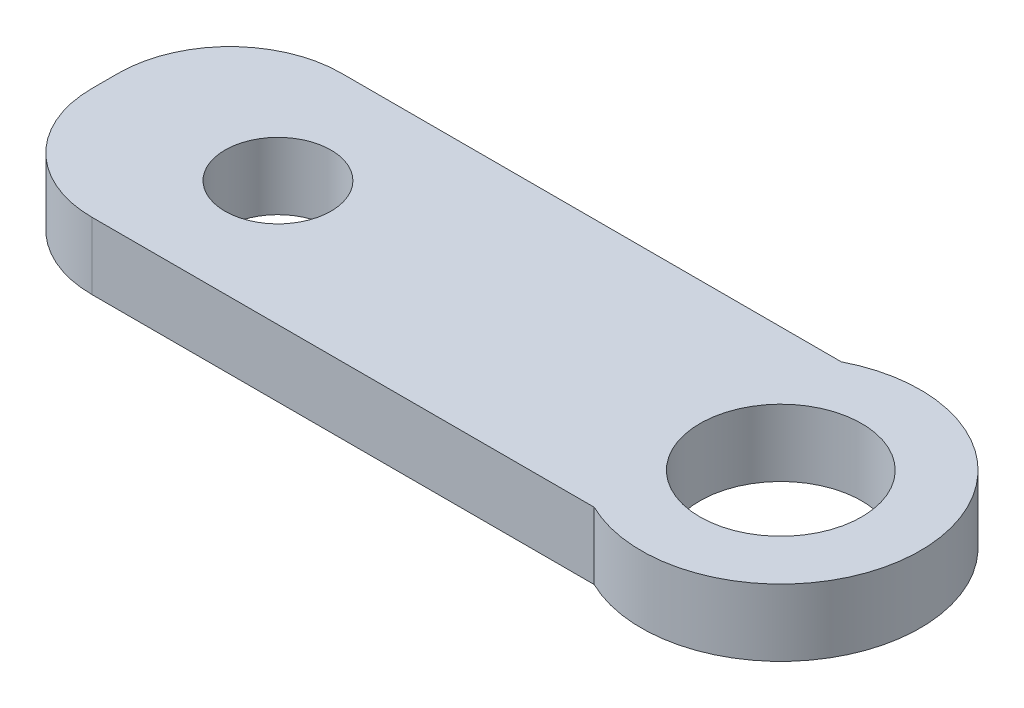
ISO-10303-21;
HEADER;
FILE_DESCRIPTION(('STEP AP214'),'2;1');
FILE_NAME('part.step','',(''),(''),'','','');
FILE_SCHEMA(('AUTOMOTIVE_DESIGN { 1 0 10303 214 1 1 1 1 }'));
ENDSEC;
DATA;
#1=APPLICATION_CONTEXT('core data for automotive mechanical design processes');
#2=APPLICATION_PROTOCOL_DEFINITION('international standard','automotive_design',2000,#1);
#3=PRODUCT_CONTEXT('',#1,'mechanical');
#4=PRODUCT('Part','Part','',(#3));
#5=PRODUCT_RELATED_PRODUCT_CATEGORY('part','',(#4));
#6=PRODUCT_DEFINITION_FORMATION('','',#4);
#7=PRODUCT_DEFINITION_CONTEXT('part definition',#1,'design');
#8=PRODUCT_DEFINITION('design','',#6,#7);
#9=PRODUCT_DEFINITION_SHAPE('','',#8);
#10=(LENGTH_UNIT() NAMED_UNIT(*) SI_UNIT(.MILLI.,.METRE.));
#11=(NAMED_UNIT(*) PLANE_ANGLE_UNIT() SI_UNIT($,.RADIAN.));
#12=(NAMED_UNIT(*) SI_UNIT($,.STERADIAN.) SOLID_ANGLE_UNIT());
#13=UNCERTAINTY_MEASURE_WITH_UNIT(LENGTH_MEASURE(1.E-05),#10,'distance_accuracy_value','');
#14=(GEOMETRIC_REPRESENTATION_CONTEXT(3) GLOBAL_UNCERTAINTY_ASSIGNED_CONTEXT((#13)) GLOBAL_UNIT_ASSIGNED_CONTEXT((#10,
#11,#12)) REPRESENTATION_CONTEXT('',''));
#15=CARTESIAN_POINT('',(0.,0.,0.));
#16=DIRECTION('',(0.,0.,1.));
#17=DIRECTION('',(1.,0.,0.));
#18=AXIS2_PLACEMENT_3D('',#15,#16,#17);
#19=CARTESIAN_POINT('',(0.,1.2,0.));
#20=DIRECTION('',(0.,-1.,0.));
#21=DIRECTION('',(0.,0.,-1.));
#22=AXIS2_PLACEMENT_3D('',#19,#20,#21);
#23=CYLINDRICAL_SURFACE('',#22,2.5);
#24=CARTESIAN_POINT('',(0.,0.,0.));
#25=DIRECTION('',(0.,1.,0.));
#26=DIRECTION('',(0.,0.,1.));
#27=AXIS2_PLACEMENT_3D('',#24,#25,#26);
#28=CIRCLE('',#27,2.5);
#29=CARTESIAN_POINT('',(-1.09697996320801,0.,2.24647166915591));
#30=VERTEX_POINT('',#29);
#31=CARTESIAN_POINT('',(-1.14071851657187,0.,-2.22458114393476));
#32=VERTEX_POINT('',#31);
#33=EDGE_CURVE('E107',#30,#32,#28,.T.);
#34=ORIENTED_EDGE('',*,*,#33,.T.);
#35=DIRECTION('',(0.,-1.,0.));
#36=VECTOR('',#35,1.);
#37=CARTESIAN_POINT('',(-1.14071851657187,1.2,-2.22458114393476));
#38=LINE('',#37,#36);
#39=CARTESIAN_POINT('',(-1.14071851657187,1.2,-2.22458114393476));
#40=VERTEX_POINT('',#39);
#41=EDGE_CURVE('E92',#40,#32,#38,.T.);
#42=ORIENTED_EDGE('',*,*,#41,.F.);
#43=CARTESIAN_POINT('',(0.,1.2,0.));
#44=DIRECTION('',(0.,1.,0.));
#45=DIRECTION('',(0.,0.,1.));
#46=AXIS2_PLACEMENT_3D('',#43,#44,#45);
#47=CIRCLE('',#46,2.5);
#48=CARTESIAN_POINT('',(-1.09697996320801,1.2,2.24647166915591));
#49=VERTEX_POINT('',#48);
#50=EDGE_CURVE('E96',#49,#40,#47,.T.);
#51=ORIENTED_EDGE('',*,*,#50,.F.);
#52=DIRECTION('',(0.,-1.,0.));
#53=VECTOR('',#52,1.);
#54=CARTESIAN_POINT('',(-1.09697996320801,1.2,2.24647166915591));
#55=LINE('',#54,#53);
#56=EDGE_CURVE('E109',#49,#30,#55,.T.);
#57=ORIENTED_EDGE('',*,*,#56,.T.);
#58=EDGE_LOOP('',(#34,#42,#51,#57));
#59=FACE_BOUND('',#58,.T.);
#60=ADVANCED_FACE('F35',(#59),#23,.T.);
#61=CARTESIAN_POINT('',(-1.14071851657187,1.2,-2.22458114393476));
#62=DIRECTION('',(0.,0.,1.));
#63=DIRECTION('',(1.,0.,0.));
#64=AXIS2_PLACEMENT_3D('',#61,#62,#63);
#65=PLANE('',#64);
#66=DIRECTION('',(-1.,0.,0.));
#67=VECTOR('',#66,1.);
#68=CARTESIAN_POINT('',(-1.14071851657187,0.,-2.22458114393476));
#69=LINE('',#68,#67);
#70=CARTESIAN_POINT('',(-10.096979963208,0.,-2.22458114393476));
#71=VERTEX_POINT('',#70);
#72=EDGE_CURVE('E135',#32,#71,#69,.T.);
#73=ORIENTED_EDGE('',*,*,#72,.T.);
#74=DIRECTION('',(0.,-1.,0.));
#75=VECTOR('',#74,1.);
#76=CARTESIAN_POINT('',(-10.096979963208,1.2,-2.22458114393476));
#77=LINE('',#76,#75);
#78=CARTESIAN_POINT('',(-10.096979963208,1.2,-2.22458114393476));
#79=VERTEX_POINT('',#78);
#80=EDGE_CURVE('E58',#71,#79,#77,.F.);
#81=ORIENTED_EDGE('',*,*,#80,.T.);
#82=DIRECTION('',(-1.,0.,0.));
#83=VECTOR('',#82,1.);
#84=CARTESIAN_POINT('',(-1.14071851657187,1.2,-2.22458114393476));
#85=LINE('',#84,#83);
#86=EDGE_CURVE('E88',#40,#79,#85,.T.);
#87=ORIENTED_EDGE('',*,*,#86,.F.);
#88=ORIENTED_EDGE('',*,*,#41,.T.);
#89=EDGE_LOOP('',(#73,#81,#87,#88));
#90=FACE_BOUND('',#89,.T.);
#91=ADVANCED_FACE('F90',(#90),#65,.F.);
#92=CARTESIAN_POINT('',(-12.096979963208,1.2,2.24647166915591));
#93=DIRECTION('',(1.,0.,0.));
#94=DIRECTION('',(0.,0.,-1.));
#95=AXIS2_PLACEMENT_3D('',#92,#93,#94);
#96=PLANE('',#95);
#97=DIRECTION('',(0.,0.,1.));
#98=VECTOR('',#97,1.);
#99=CARTESIAN_POINT('',(-12.096979963208,1.2,2.24647166915591));
#100=LINE('',#99,#98);
#101=CARTESIAN_POINT('',(-12.096979963208,1.2,-0.224581143934756));
#102=VERTEX_POINT('',#101);
#103=CARTESIAN_POINT('',(-12.096979963208,1.2,0.246471669155913));
#104=VERTEX_POINT('',#103);
#105=EDGE_CURVE('E95',#102,#104,#100,.T.);
#106=ORIENTED_EDGE('',*,*,#105,.F.);
#107=DIRECTION('',(0.,-1.,0.));
#108=VECTOR('',#107,1.);
#109=CARTESIAN_POINT('',(-12.096979963208,1.2,-0.224581143934756));
#110=LINE('',#109,#108);
#111=CARTESIAN_POINT('',(-12.096979963208,0.,-0.224581143934756));
#112=VERTEX_POINT('',#111);
#113=EDGE_CURVE('E111',#102,#112,#110,.T.);
#114=ORIENTED_EDGE('',*,*,#113,.T.);
#115=DIRECTION('',(0.,0.,1.));
#116=VECTOR('',#115,1.);
#117=CARTESIAN_POINT('',(-12.096979963208,0.,2.24647166915591));
#118=LINE('',#117,#116);
#119=CARTESIAN_POINT('',(-12.096979963208,0.,0.246471669155913));
#120=VERTEX_POINT('',#119);
#121=EDGE_CURVE('E136',#112,#120,#118,.T.);
#122=ORIENTED_EDGE('',*,*,#121,.T.);
#123=DIRECTION('',(0.,-1.,0.));
#124=VECTOR('',#123,1.);
#125=CARTESIAN_POINT('',(-12.096979963208,1.2,0.246471669155913));
#126=LINE('',#125,#124);
#127=EDGE_CURVE('E108',#120,#104,#126,.F.);
#128=ORIENTED_EDGE('',*,*,#127,.T.);
#129=EDGE_LOOP('',(#106,#114,#122,#128));
#130=FACE_BOUND('',#129,.T.);
#131=ADVANCED_FACE('F127',(#130),#96,.F.);
#132=CARTESIAN_POINT('',(-1.09697996320801,1.2,2.24647166915591));
#133=DIRECTION('',(0.,0.,-1.));
#134=DIRECTION('',(-1.,0.,0.));
#135=AXIS2_PLACEMENT_3D('',#132,#133,#134);
#136=PLANE('',#135);
#137=DIRECTION('',(1.,0.,0.));
#138=VECTOR('',#137,1.);
#139=CARTESIAN_POINT('',(-1.09697996320801,1.2,2.24647166915591));
#140=LINE('',#139,#138);
#141=CARTESIAN_POINT('',(-10.096979963208,1.2,2.24647166915591));
#142=VERTEX_POINT('',#141);
#143=EDGE_CURVE('E100',#142,#49,#140,.T.);
#144=ORIENTED_EDGE('',*,*,#143,.F.);
#145=DIRECTION('',(0.,-1.,0.));
#146=VECTOR('',#145,1.);
#147=CARTESIAN_POINT('',(-10.096979963208,1.2,2.24647166915591));
#148=LINE('',#147,#146);
#149=CARTESIAN_POINT('',(-10.096979963208,0.,2.24647166915591));
#150=VERTEX_POINT('',#149);
#151=EDGE_CURVE('E11',#142,#150,#148,.T.);
#152=ORIENTED_EDGE('',*,*,#151,.T.);
#153=DIRECTION('',(1.,0.,0.));
#154=VECTOR('',#153,1.);
#155=CARTESIAN_POINT('',(-1.09697996320801,0.,2.24647166915591));
#156=LINE('',#155,#154);
#157=EDGE_CURVE('E104',#150,#30,#156,.T.);
#158=ORIENTED_EDGE('',*,*,#157,.T.);
#159=ORIENTED_EDGE('',*,*,#56,.F.);
#160=EDGE_LOOP('',(#144,#152,#158,#159));
#161=FACE_BOUND('',#160,.T.);
#162=ADVANCED_FACE('F144',(#161),#136,.F.);
#163=CARTESIAN_POINT('',(0.,1.2,0.));
#164=DIRECTION('',(0.,1.,0.));
#165=DIRECTION('',(0.,0.,1.));
#166=AXIS2_PLACEMENT_3D('',#163,#164,#165);
#167=PLANE('',#166);
#168=CARTESIAN_POINT('',(-9.,1.2,0.0109452626105785));
#169=DIRECTION('',(0.,1.,0.));
#170=DIRECTION('',(0.,0.,1.));
#171=AXIS2_PLACEMENT_3D('',#168,#169,#170);
#172=CIRCLE('',#171,0.949999999999999);
#173=CARTESIAN_POINT('',(-9.,1.2,0.960945262610578));
#174=VERTEX_POINT('',#173);
#175=EDGE_CURVE('E188',#174,#174,#172,.T.);
#176=ORIENTED_EDGE('',*,*,#175,.F.);
#177=EDGE_LOOP('',(#176));
#178=FACE_BOUND('',#177,.T.);
#179=CARTESIAN_POINT('',(0.,1.2,0.));
#180=DIRECTION('',(0.,1.,0.));
#181=DIRECTION('',(0.,0.,1.));
#182=AXIS2_PLACEMENT_3D('',#179,#180,#181);
#183=CIRCLE('',#182,1.45);
#184=CARTESIAN_POINT('',(0.,1.2,1.45));
#185=VERTEX_POINT('',#184);
#186=EDGE_CURVE('E182',#185,#185,#183,.T.);
#187=ORIENTED_EDGE('',*,*,#186,.F.);
#188=EDGE_LOOP('',(#187));
#189=FACE_BOUND('',#188,.T.);
#190=ORIENTED_EDGE('',*,*,#86,.T.);
#191=CARTESIAN_POINT('',(-10.096979963208,1.2,-0.224581143934756));
#192=DIRECTION('',(0.,1.,0.));
#193=DIRECTION('',(0.,0.,1.));
#194=AXIS2_PLACEMENT_3D('',#191,#192,#193);
#195=CIRCLE('',#194,2.);
#196=EDGE_CURVE('E43',#79,#102,#195,.T.);
#197=ORIENTED_EDGE('',*,*,#196,.T.);
#198=ORIENTED_EDGE('',*,*,#105,.T.);
#199=CARTESIAN_POINT('',(-10.096979963208,1.2,0.246471669155913));
#200=DIRECTION('',(0.,1.,0.));
#201=DIRECTION('',(0.,0.,1.));
#202=AXIS2_PLACEMENT_3D('',#199,#200,#201);
#203=CIRCLE('',#202,2.);
#204=EDGE_CURVE('E50',#104,#142,#203,.T.);
#205=ORIENTED_EDGE('',*,*,#204,.T.);
#206=ORIENTED_EDGE('',*,*,#143,.T.);
#207=ORIENTED_EDGE('',*,*,#50,.T.);
#208=EDGE_LOOP('',(#190,#197,#198,#205,#206,#207));
#209=FACE_BOUND('',#208,.T.);
#210=ADVANCED_FACE('F99',(#178,#189,#209),#167,.T.);
#211=CARTESIAN_POINT('',(0.,0.,0.));
#212=DIRECTION('',(0.,1.,0.));
#213=DIRECTION('',(0.,0.,1.));
#214=AXIS2_PLACEMENT_3D('',#211,#212,#213);
#215=PLANE('',#214);
#216=CARTESIAN_POINT('',(-9.,0.,0.0109452626105785));
#217=DIRECTION('',(0.,1.,0.));
#218=DIRECTION('',(0.,0.,1.));
#219=AXIS2_PLACEMENT_3D('',#216,#217,#218);
#220=CIRCLE('',#219,0.949999999999999);
#221=CARTESIAN_POINT('',(-9.,0.,0.960945262610578));
#222=VERTEX_POINT('',#221);
#223=EDGE_CURVE('E184',#222,#222,#220,.T.);
#224=ORIENTED_EDGE('',*,*,#223,.T.);
#225=EDGE_LOOP('',(#224));
#226=FACE_BOUND('',#225,.T.);
#227=CARTESIAN_POINT('',(0.,0.,0.));
#228=DIRECTION('',(0.,1.,0.));
#229=DIRECTION('',(0.,0.,1.));
#230=AXIS2_PLACEMENT_3D('',#227,#228,#229);
#231=CIRCLE('',#230,1.45);
#232=CARTESIAN_POINT('',(0.,0.,1.45));
#233=VERTEX_POINT('',#232);
#234=EDGE_CURVE('E139',#233,#233,#231,.T.);
#235=ORIENTED_EDGE('',*,*,#234,.T.);
#236=EDGE_LOOP('',(#235));
#237=FACE_BOUND('',#236,.T.);
#238=ORIENTED_EDGE('',*,*,#121,.F.);
#239=CARTESIAN_POINT('',(-10.096979963208,0.,-0.224581143934756));
#240=DIRECTION('',(0.,1.,0.));
#241=DIRECTION('',(0.,0.,1.));
#242=AXIS2_PLACEMENT_3D('',#239,#240,#241);
#243=CIRCLE('',#242,2.);
#244=EDGE_CURVE('E120',#112,#71,#243,.F.);
#245=ORIENTED_EDGE('',*,*,#244,.T.);
#246=ORIENTED_EDGE('',*,*,#72,.F.);
#247=ORIENTED_EDGE('',*,*,#33,.F.);
#248=ORIENTED_EDGE('',*,*,#157,.F.);
#249=CARTESIAN_POINT('',(-10.096979963208,0.,0.246471669155913));
#250=DIRECTION('',(0.,1.,0.));
#251=DIRECTION('',(0.,0.,1.));
#252=AXIS2_PLACEMENT_3D('',#249,#250,#251);
#253=CIRCLE('',#252,2.);
#254=EDGE_CURVE('E118',#150,#120,#253,.F.);
#255=ORIENTED_EDGE('',*,*,#254,.T.);
#256=EDGE_LOOP('',(#238,#245,#246,#247,#248,#255));
#257=FACE_BOUND('',#256,.T.);
#258=ADVANCED_FACE('F134',(#226,#237,#257),#215,.F.);
#259=CARTESIAN_POINT('',(0.,0.,0.));
#260=DIRECTION('',(0.,1.,0.));
#261=DIRECTION('',(0.,0.,1.));
#262=AXIS2_PLACEMENT_3D('',#259,#260,#261);
#263=CYLINDRICAL_SURFACE('',#262,1.45);
#264=ORIENTED_EDGE('',*,*,#234,.F.);
#265=EDGE_LOOP('',(#264));
#266=FACE_BOUND('',#265,.T.);
#267=ORIENTED_EDGE('',*,*,#186,.T.);
#268=EDGE_LOOP('',(#267));
#269=FACE_BOUND('',#268,.T.);
#270=ADVANCED_FACE('F155',(#266,#269),#263,.F.);
#271=CARTESIAN_POINT('',(-10.096979963208,1.2,-0.224581143934756));
#272=DIRECTION('',(0.,-1.,0.));
#273=DIRECTION('',(0.,0.,-1.));
#274=AXIS2_PLACEMENT_3D('',#271,#272,#273);
#275=CYLINDRICAL_SURFACE('',#274,2.);
#276=ORIENTED_EDGE('',*,*,#196,.F.);
#277=ORIENTED_EDGE('',*,*,#80,.F.);
#278=ORIENTED_EDGE('',*,*,#244,.F.);
#279=ORIENTED_EDGE('',*,*,#113,.F.);
#280=EDGE_LOOP('',(#276,#277,#278,#279));
#281=FACE_BOUND('',#280,.T.);
#282=ADVANCED_FACE('F132',(#281),#275,.T.);
#283=CARTESIAN_POINT('',(-10.096979963208,1.2,0.246471669155913));
#284=DIRECTION('',(0.,-1.,0.));
#285=DIRECTION('',(0.,0.,-1.));
#286=AXIS2_PLACEMENT_3D('',#283,#284,#285);
#287=CYLINDRICAL_SURFACE('',#286,2.);
#288=ORIENTED_EDGE('',*,*,#204,.F.);
#289=ORIENTED_EDGE('',*,*,#127,.F.);
#290=ORIENTED_EDGE('',*,*,#254,.F.);
#291=ORIENTED_EDGE('',*,*,#151,.F.);
#292=EDGE_LOOP('',(#288,#289,#290,#291));
#293=FACE_BOUND('',#292,.T.);
#294=ADVANCED_FACE('F37',(#293),#287,.T.);
#295=CARTESIAN_POINT('',(-9.,0.,0.0109452626105785));
#296=DIRECTION('',(0.,1.,0.));
#297=DIRECTION('',(0.,0.,1.));
#298=AXIS2_PLACEMENT_3D('',#295,#296,#297);
#299=CYLINDRICAL_SURFACE('',#298,0.949999999999999);
#300=ORIENTED_EDGE('',*,*,#223,.F.);
#301=EDGE_LOOP('',(#300));
#302=FACE_BOUND('',#301,.T.);
#303=ORIENTED_EDGE('',*,*,#175,.T.);
#304=EDGE_LOOP('',(#303));
#305=FACE_BOUND('',#304,.T.);
#306=ADVANCED_FACE('F148',(#302,#305),#299,.F.);
#307=CLOSED_SHELL('',(#60,#91,#131,#162,#210,#258,#270,#282,#294,#306));
#308=MANIFOLD_SOLID_BREP('B2',#307);
#309=ADVANCED_BREP_SHAPE_REPRESENTATION('',(#18,#308),#14);
#310=SHAPE_DEFINITION_REPRESENTATION(#9,#309);
ENDSEC;
END-ISO-10303-21;
